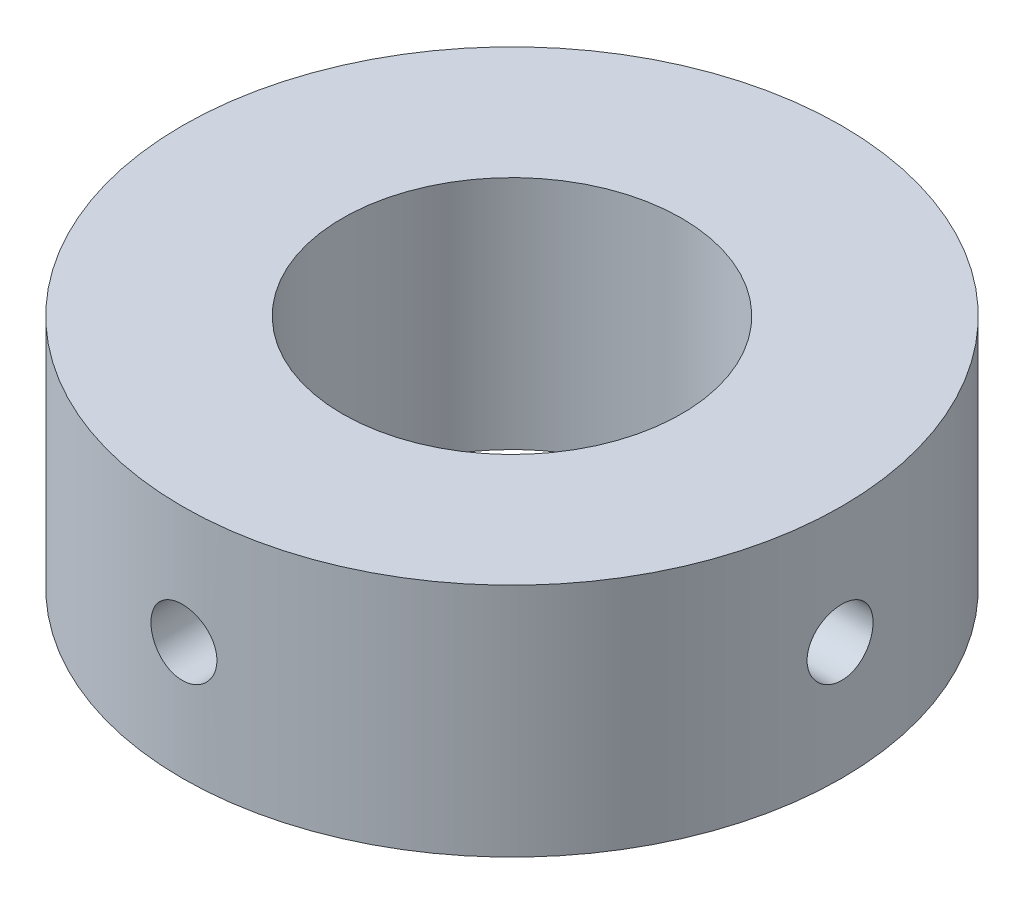
ISO-10303-21;
HEADER;
FILE_DESCRIPTION(('STEP AP214'),'2;1');
FILE_NAME('part.step','',(''),(''),'','','');
FILE_SCHEMA(('AUTOMOTIVE_DESIGN { 1 0 10303 214 1 1 1 1 }'));
ENDSEC;
DATA;
#1=APPLICATION_CONTEXT('core data for automotive mechanical design processes');
#2=APPLICATION_PROTOCOL_DEFINITION('international standard','automotive_design',2000,#1);
#3=PRODUCT_CONTEXT('',#1,'mechanical');
#4=PRODUCT('Part','Part','',(#3));
#5=PRODUCT_RELATED_PRODUCT_CATEGORY('part','',(#4));
#6=PRODUCT_DEFINITION_FORMATION('','',#4);
#7=PRODUCT_DEFINITION_CONTEXT('part definition',#1,'design');
#8=PRODUCT_DEFINITION('design','',#6,#7);
#9=PRODUCT_DEFINITION_SHAPE('','',#8);
#10=(LENGTH_UNIT() NAMED_UNIT(*) SI_UNIT(.MILLI.,.METRE.));
#11=(NAMED_UNIT(*) PLANE_ANGLE_UNIT() SI_UNIT($,.RADIAN.));
#12=(NAMED_UNIT(*) SI_UNIT($,.STERADIAN.) SOLID_ANGLE_UNIT());
#13=UNCERTAINTY_MEASURE_WITH_UNIT(LENGTH_MEASURE(1.E-05),#10,'distance_accuracy_value','');
#14=(GEOMETRIC_REPRESENTATION_CONTEXT(3) GLOBAL_UNCERTAINTY_ASSIGNED_CONTEXT((#13)) GLOBAL_UNIT_ASSIGNED_CONTEXT((#10,
#11,#12)) REPRESENTATION_CONTEXT('',''));
#15=CARTESIAN_POINT('',(0.,0.,0.));
#16=DIRECTION('',(0.,0.,1.));
#17=DIRECTION('',(1.,0.,0.));
#18=AXIS2_PLACEMENT_3D('',#15,#16,#17);
#19=CARTESIAN_POINT('',(0.,6.35,0.));
#20=DIRECTION('',(0.,-1.,0.));
#21=DIRECTION('',(0.,0.,-1.));
#22=AXIS2_PLACEMENT_3D('',#19,#20,#21);
#23=CYLINDRICAL_SURFACE('',#22,8.89);
#24=CARTESIAN_POINT('',(0.,6.35,0.));
#25=DIRECTION('',(0.,1.,0.));
#26=DIRECTION('',(0.,0.,1.));
#27=AXIS2_PLACEMENT_3D('',#24,#25,#26);
#28=CIRCLE('',#27,8.89);
#29=CARTESIAN_POINT('',(0.,6.35,8.89));
#30=VERTEX_POINT('',#29);
#31=EDGE_CURVE('E10',#30,#30,#28,.T.);
#32=ORIENTED_EDGE('',*,*,#31,.F.);
#33=EDGE_LOOP('',(#32));
#34=FACE_BOUND('',#33,.T.);
#35=CARTESIAN_POINT('',(0.,0.,0.));
#36=DIRECTION('',(0.,1.,0.));
#37=DIRECTION('',(0.,0.,1.));
#38=AXIS2_PLACEMENT_3D('',#35,#36,#37);
#39=CIRCLE('',#38,8.89);
#40=CARTESIAN_POINT('',(0.,0.,8.89));
#41=VERTEX_POINT('',#40);
#42=EDGE_CURVE('E40',#41,#41,#39,.T.);
#43=ORIENTED_EDGE('',*,*,#42,.T.);
#44=EDGE_LOOP('',(#43));
#45=FACE_BOUND('',#44,.T.);
#46=CARTESIAN_POINT('',(8.84543831587785,3.175,0.889));
#47=CARTESIAN_POINT('',(8.84543889986447,3.22480139255033,0.888997842746832));
#48=CARTESIAN_POINT('',(8.8458634346786,3.27463571371813,0.884801127635421));
#49=CARTESIAN_POINT('',(8.84751546839168,3.37292268061495,0.868123003824806));
#50=CARTESIAN_POINT('',(8.84874385217024,3.42137374223533,0.855632465034041));
#51=CARTESIAN_POINT('',(8.85186308279127,3.51545661328472,0.822734043185276));
#52=CARTESIAN_POINT('',(8.85375352795096,3.56109011246899,0.802330959985276));
#53=CARTESIAN_POINT('',(8.85798338128348,3.64827496734736,0.754195833710689));
#54=CARTESIAN_POINT('',(8.86032270026188,3.68982713155602,0.726465246251448));
#55=CARTESIAN_POINT('',(8.865196248451,3.76783077339152,0.664353933416848));
#56=CARTESIAN_POINT('',(8.86773108344681,3.80426532344886,0.629951994698243));
#57=CARTESIAN_POINT('',(8.87270455154554,3.87085373440417,0.555519844919092));
#58=CARTESIAN_POINT('',(8.87514318024264,3.90100730793221,0.515489376479939));
#59=CARTESIAN_POINT('',(8.87965544625333,3.95423628747936,0.430832835507727));
#60=CARTESIAN_POINT('',(8.88172830745341,3.97729671792757,0.386197301988787));
#61=CARTESIAN_POINT('',(8.8852688920256,4.01558900106918,0.293663356031597));
#62=CARTESIAN_POINT('',(8.8867366301481,4.03082104458846,0.245765023160047));
#63=CARTESIAN_POINT('',(8.88889734281642,4.05297454141504,0.148236111858483));
#64=CARTESIAN_POINT('',(8.88959290772264,4.0599237863147,0.0986119045310767));
#65=CARTESIAN_POINT('',(8.89013971167237,4.06540041425987,-0.00110301847246971));
#66=CARTESIAN_POINT('',(8.88999097260747,4.06392801566644,-0.0511937220194155));
#67=CARTESIAN_POINT('',(8.88886804795644,4.05262571381401,-0.150231082373393));
#68=CARTESIAN_POINT('',(8.88789681403872,4.0428256952637,-0.199181187812196));
#69=CARTESIAN_POINT('',(8.88524144316523,4.01519289636645,-0.294738330579529));
#70=CARTESIAN_POINT('',(8.88355729694902,3.99736001167585,-0.34134533746342));
#71=CARTESIAN_POINT('',(8.87966037423201,3.9541349234668,-0.430987479750152));
#72=CARTESIAN_POINT('',(8.87744667428159,3.92872949549569,-0.474016196602686));
#73=CARTESIAN_POINT('',(8.87273903837753,3.87109009075397,-0.555210293211857));
#74=CARTESIAN_POINT('',(8.87024509420595,3.83885591371093,-0.593375530280575));
#75=CARTESIAN_POINT('',(8.8652439589292,3.76830594996237,-0.66393433415037));
#76=CARTESIAN_POINT('',(8.86273675761421,3.72996416652474,-0.696301912363215));
#77=CARTESIAN_POINT('',(8.8580025779619,3.64837750682762,-0.754145398933188));
#78=CARTESIAN_POINT('',(8.85577560003104,3.60513262345605,-0.779621297293558));
#79=CARTESIAN_POINT('',(8.85185380578078,3.51494735459739,-0.822958132085601));
#80=CARTESIAN_POINT('',(8.85015910168841,3.46800619237605,-0.840817462889361));
#81=CARTESIAN_POINT('',(8.84749603763263,3.37177072249754,-0.868393633981816));
#82=CARTESIAN_POINT('',(8.84652765554072,3.32247648657906,-0.878110722337556));
#83=CARTESIAN_POINT('',(8.84543070088873,3.22316230439827,-0.889093145323452));
#84=CARTESIAN_POINT('',(8.84529851565819,3.17314641698456,-0.890394838019371));
#85=CARTESIAN_POINT('',(8.84587938654392,3.07360842468348,-0.884605003468641));
#86=CARTESIAN_POINT('',(8.84659243123927,3.02408631313321,-0.877513589631271));
#87=CARTESIAN_POINT('',(8.84878013191515,2.92704760335455,-0.855169260137185));
#88=CARTESIAN_POINT('',(8.85025318339196,2.87952700729685,-0.839933536070939));
#89=CARTESIAN_POINT('',(8.85379361733488,2.78771599401176,-0.80175062379191));
#90=CARTESIAN_POINT('',(8.85586101341487,2.7434256508047,-0.77880325893661));
#91=CARTESIAN_POINT('',(8.86036593492229,2.65916666308842,-0.725757376265241));
#92=CARTESIAN_POINT('',(8.86280469714243,2.619213253592,-0.695634765558375));
#93=CARTESIAN_POINT('',(8.8677735120379,2.54491675763936,-0.629127994238094));
#94=CARTESIAN_POINT('',(8.8703035669724,2.51057381013767,-0.592743678586592));
#95=CARTESIAN_POINT('',(8.87518079538029,2.4483477279091,-0.514588585957336));
#96=CARTESIAN_POINT('',(8.87752727715317,2.42048831152785,-0.472798875556844));
#97=CARTESIAN_POINT('',(8.88176290032794,2.3721833328978,-0.38511277078383));
#98=CARTESIAN_POINT('',(8.88365204799621,2.35173766906418,-0.339216432691938));
#99=CARTESIAN_POINT('',(8.88675702058051,2.31888076055441,-0.244702696398774));
#100=CARTESIAN_POINT('',(8.88797404550421,2.30645519006788,-0.196090319470815));
#101=CARTESIAN_POINT('',(8.88960256911534,2.28994443114352,-0.0974564596314919));
#102=CARTESIAN_POINT('',(8.89001409044164,2.28585900830354,-0.0474350163623827));
#103=CARTESIAN_POINT('',(8.88998522760497,2.28614781086511,0.0523640772033374));
#104=CARTESIAN_POINT('',(8.88954855136859,2.29048521554779,0.102141839222604));
#105=CARTESIAN_POINT('',(8.88787967790478,2.30741933988905,0.200257818748805));
#106=CARTESIAN_POINT('',(8.88664748005292,2.32001606603057,0.248596035125776));
#107=CARTESIAN_POINT('',(8.88352562470611,2.35310105982232,0.342460498894523));
#108=CARTESIAN_POINT('',(8.88163605688888,2.37358825110447,0.387987128842922));
#109=CARTESIAN_POINT('',(8.87741009238087,2.42186868716719,0.474961229537612));
#110=CARTESIAN_POINT('',(8.87507369830463,2.44966188919802,0.516408724150248));
#111=CARTESIAN_POINT('',(8.8702036117079,2.51190345131211,0.594236692015547));
#112=CARTESIAN_POINT('',(8.86766913308561,2.54637922444163,0.630595193408993));
#113=CARTESIAN_POINT('',(8.86269517194226,2.6209532875239,0.697027348100503));
#114=CARTESIAN_POINT('',(8.86025571236453,2.66105292479531,0.727099491052736));
#115=CARTESIAN_POINT('',(8.85574134852024,2.7458479999668,0.780165633336982));
#116=CARTESIAN_POINT('',(8.85366738721597,2.79055486709708,0.803141436127408));
#117=CARTESIAN_POINT('',(8.85013008143828,2.8831842309179,0.841229325499805));
#118=CARTESIAN_POINT('',(8.84866604859836,2.93110303128996,0.856350281864083));
#119=CARTESIAN_POINT('',(8.84688356701411,3.01191094165931,0.874528580928507));
#120=CARTESIAN_POINT('',(8.84634416090832,3.04428344141141,0.879947946322022));
#121=CARTESIAN_POINT('',(8.84562134382943,3.10943253668483,0.887184358499946));
#122=CARTESIAN_POINT('',(8.84543793136192,3.14220913050925,0.889001420406207));
#123=CARTESIAN_POINT('',(8.84543831587785,3.175,0.889));
#124=B_SPLINE_CURVE_WITH_KNOTS('',3,(#46,#47,#48,#49,#50,#51,#52,#53,#54,#55,#56,#57,#58,#59,
#60,#61,#62,#63,#64,#65,#66,#67,#68,#69,#70,#71,#72,#73,#74,#75,#76,#77,#78,#79,#80,#81,#82,#83,
#84,#85,#86,#87,#88,#89,#90,#91,#92,#93,#94,#95,#96,#97,#98,#99,#100,#101,#102,#103,#104,#105,
#106,#107,#108,#109,#110,#111,#112,#113,#114,#115,#116,#117,#118,#119,#120,#121,#122,#123),
.UNSPECIFIED.,.T.,.F.,(4,2,2,2,2,2,2,2,2,2,2,2,2,2,2,2,2,2,2,2,2,2,2,2,2,2,2,2,2,2,2,2,2,2,2,2,
2,2,4),(0.,0.149284431054015,0.298733471969553,0.448091996496754,0.597420873094548,
0.747232606001034,0.897051191653198,1.04718394804478,1.19731304460529,1.34693697628722,
1.49655702845428,1.6456424068679,1.79472972189586,1.94407893919641,2.09343253719272,
2.24343972900566,2.39344713841103,2.54348615485843,2.69352059994984,2.84290639717603,
2.99229017589548,3.14135986272324,3.29043296436771,3.44001385742617,3.58959845459927,
3.73972195631307,3.88984340092506,4.03969594505287,4.1895442774759,4.33873901653481,
4.48793387270029,4.63710838383774,4.786282022128,4.93608106668771,5.08591606035693,
5.23613213311653,5.38617820940767,5.48447238541775,5.58276614880492),.UNSPECIFIED.);
#125=CARTESIAN_POINT('',(8.84543831587785,3.175,0.889));
#126=VERTEX_POINT('',#125);
#127=EDGE_CURVE('E59',#126,#126,#124,.T.);
#128=ORIENTED_EDGE('',*,*,#127,.T.);
#129=EDGE_LOOP('',(#128));
#130=FACE_BOUND('',#129,.T.);
#131=CARTESIAN_POINT('',(-0.889,3.175,8.84543831587785));
#132=CARTESIAN_POINT('',(-0.888997842746832,3.22480139255033,8.84543889986447));
#133=CARTESIAN_POINT('',(-0.884801127635421,3.27463571371813,8.8458634346786));
#134=CARTESIAN_POINT('',(-0.868123003824806,3.37292268061495,8.84751546839168));
#135=CARTESIAN_POINT('',(-0.855632465034041,3.42137374223533,8.84874385217024));
#136=CARTESIAN_POINT('',(-0.822734043185276,3.51545661328472,8.85186308279127));
#137=CARTESIAN_POINT('',(-0.802330959985276,3.56109011246899,8.85375352795096));
#138=CARTESIAN_POINT('',(-0.754195833710689,3.64827496734736,8.85798338128348));
#139=CARTESIAN_POINT('',(-0.726465246251448,3.68982713155602,8.86032270026188));
#140=CARTESIAN_POINT('',(-0.664353933416848,3.76783077339152,8.865196248451));
#141=CARTESIAN_POINT('',(-0.629951994698243,3.80426532344886,8.86773108344681));
#142=CARTESIAN_POINT('',(-0.555519844919092,3.87085373440417,8.87270455154554));
#143=CARTESIAN_POINT('',(-0.515489376479939,3.90100730793221,8.87514318024264));
#144=CARTESIAN_POINT('',(-0.430832835507727,3.95423628747936,8.87965544625333));
#145=CARTESIAN_POINT('',(-0.386197301988787,3.97729671792757,8.88172830745341));
#146=CARTESIAN_POINT('',(-0.293663356031597,4.01558900106918,8.8852688920256));
#147=CARTESIAN_POINT('',(-0.245765023160047,4.03082104458846,8.8867366301481));
#148=CARTESIAN_POINT('',(-0.148236111858483,4.05297454141504,8.88889734281642));
#149=CARTESIAN_POINT('',(-0.0986119045310767,4.0599237863147,8.88959290772264));
#150=CARTESIAN_POINT('',(0.00110301847246974,4.06540041425987,8.89013971167237));
#151=CARTESIAN_POINT('',(0.0511937220194155,4.06392801566644,8.88999097260747));
#152=CARTESIAN_POINT('',(0.150231082373393,4.05262571381401,8.88886804795644));
#153=CARTESIAN_POINT('',(0.199181187812196,4.0428256952637,8.88789681403872));
#154=CARTESIAN_POINT('',(0.294738330579529,4.01519289636645,8.88524144316523));
#155=CARTESIAN_POINT('',(0.34134533746342,3.99736001167585,8.88355729694902));
#156=CARTESIAN_POINT('',(0.430987479750152,3.9541349234668,8.87966037423201));
#157=CARTESIAN_POINT('',(0.474016196602686,3.92872949549569,8.87744667428159));
#158=CARTESIAN_POINT('',(0.555210293211857,3.87109009075397,8.87273903837753));
#159=CARTESIAN_POINT('',(0.593375530280575,3.83885591371093,8.87024509420595));
#160=CARTESIAN_POINT('',(0.66393433415037,3.76830594996237,8.8652439589292));
#161=CARTESIAN_POINT('',(0.696301912363215,3.72996416652474,8.86273675761421));
#162=CARTESIAN_POINT('',(0.754145398933188,3.64837750682762,8.8580025779619));
#163=CARTESIAN_POINT('',(0.779621297293558,3.60513262345605,8.85577560003104));
#164=CARTESIAN_POINT('',(0.822958132085601,3.51494735459739,8.85185380578078));
#165=CARTESIAN_POINT('',(0.840817462889361,3.46800619237605,8.85015910168841));
#166=CARTESIAN_POINT('',(0.868393633981816,3.37177072249754,8.84749603763263));
#167=CARTESIAN_POINT('',(0.878110722337556,3.32247648657906,8.84652765554072));
#168=CARTESIAN_POINT('',(0.889093145323452,3.22316230439827,8.84543070088873));
#169=CARTESIAN_POINT('',(0.890394838019371,3.17314641698456,8.84529851565819));
#170=CARTESIAN_POINT('',(0.884605003468641,3.07360842468348,8.84587938654392));
#171=CARTESIAN_POINT('',(0.877513589631271,3.02408631313321,8.84659243123927));
#172=CARTESIAN_POINT('',(0.855169260137185,2.92704760335455,8.84878013191515));
#173=CARTESIAN_POINT('',(0.839933536070939,2.87952700729685,8.85025318339196));
#174=CARTESIAN_POINT('',(0.80175062379191,2.78771599401176,8.85379361733488));
#175=CARTESIAN_POINT('',(0.77880325893661,2.7434256508047,8.85586101341487));
#176=CARTESIAN_POINT('',(0.725757376265241,2.65916666308842,8.86036593492229));
#177=CARTESIAN_POINT('',(0.695634765558375,2.619213253592,8.86280469714243));
#178=CARTESIAN_POINT('',(0.629127994238094,2.54491675763936,8.8677735120379));
#179=CARTESIAN_POINT('',(0.592743678586592,2.51057381013767,8.8703035669724));
#180=CARTESIAN_POINT('',(0.514588585957336,2.4483477279091,8.87518079538029));
#181=CARTESIAN_POINT('',(0.472798875556844,2.42048831152785,8.87752727715317));
#182=CARTESIAN_POINT('',(0.38511277078383,2.3721833328978,8.88176290032794));
#183=CARTESIAN_POINT('',(0.339216432691938,2.35173766906418,8.88365204799621));
#184=CARTESIAN_POINT('',(0.244702696398774,2.31888076055441,8.88675702058051));
#185=CARTESIAN_POINT('',(0.196090319470815,2.30645519006788,8.88797404550421));
#186=CARTESIAN_POINT('',(0.0974564596314918,2.28994443114352,8.88960256911534));
#187=CARTESIAN_POINT('',(0.0474350163623826,2.28585900830354,8.89001409044164));
#188=CARTESIAN_POINT('',(-0.0523640772033375,2.28614781086511,8.88998522760497));
#189=CARTESIAN_POINT('',(-0.102141839222604,2.29048521554779,8.88954855136859));
#190=CARTESIAN_POINT('',(-0.200257818748805,2.30741933988905,8.88787967790478));
#191=CARTESIAN_POINT('',(-0.248596035125776,2.32001606603057,8.88664748005292));
#192=CARTESIAN_POINT('',(-0.342460498894523,2.35310105982232,8.88352562470611));
#193=CARTESIAN_POINT('',(-0.387987128842922,2.37358825110447,8.88163605688888));
#194=CARTESIAN_POINT('',(-0.474961229537612,2.42186868716719,8.87741009238087));
#195=CARTESIAN_POINT('',(-0.516408724150248,2.44966188919802,8.87507369830463));
#196=CARTESIAN_POINT('',(-0.594236692015547,2.51190345131211,8.8702036117079));
#197=CARTESIAN_POINT('',(-0.630595193408993,2.54637922444163,8.86766913308561));
#198=CARTESIAN_POINT('',(-0.697027348100503,2.6209532875239,8.86269517194226));
#199=CARTESIAN_POINT('',(-0.727099491052736,2.66105292479531,8.86025571236453));
#200=CARTESIAN_POINT('',(-0.780165633336982,2.7458479999668,8.85574134852024));
#201=CARTESIAN_POINT('',(-0.803141436127408,2.79055486709708,8.85366738721597));
#202=CARTESIAN_POINT('',(-0.841229325499805,2.8831842309179,8.85013008143828));
#203=CARTESIAN_POINT('',(-0.856350281864083,2.93110303128996,8.84866604859836));
#204=CARTESIAN_POINT('',(-0.874528580928507,3.01191094165931,8.84688356701411));
#205=CARTESIAN_POINT('',(-0.879947946322022,3.04428344141141,8.84634416090832));
#206=CARTESIAN_POINT('',(-0.887184358499946,3.10943253668483,8.84562134382943));
#207=CARTESIAN_POINT('',(-0.889001420406207,3.14220913050925,8.84543793136192));
#208=CARTESIAN_POINT('',(-0.889,3.175,8.84543831587785));
#209=B_SPLINE_CURVE_WITH_KNOTS('',3,(#131,#132,#133,#134,#135,#136,#137,#138,#139,#140,#141,
#142,#143,#144,#145,#146,#147,#148,#149,#150,#151,#152,#153,#154,#155,#156,#157,#158,#159,#160,
#161,#162,#163,#164,#165,#166,#167,#168,#169,#170,#171,#172,#173,#174,#175,#176,#177,#178,#179,
#180,#181,#182,#183,#184,#185,#186,#187,#188,#189,#190,#191,#192,#193,#194,#195,#196,#197,#198,
#199,#200,#201,#202,#203,#204,#205,#206,#207,#208),.UNSPECIFIED.,.T.,.F.,(4,2,2,2,2,2,2,2,2,2,2,
2,2,2,2,2,2,2,2,2,2,2,2,2,2,2,2,2,2,2,2,2,2,2,2,2,2,2,4),(0.,0.149284431054015,
0.298733471969553,0.448091996496754,0.597420873094548,0.747232606001034,0.897051191653198,
1.04718394804478,1.19731304460529,1.34693697628722,1.49655702845428,1.6456424068679,
1.79472972189586,1.94407893919641,2.09343253719272,2.24343972900566,2.39344713841103,
2.54348615485843,2.69352059994984,2.84290639717603,2.99229017589548,3.14135986272324,
3.29043296436771,3.44001385742617,3.58959845459927,3.73972195631307,3.88984340092506,
4.03969594505287,4.1895442774759,4.33873901653481,4.48793387270029,4.63710838383774,
4.786282022128,4.93608106668771,5.08591606035693,5.23613213311653,5.38617820940767,
5.48447238541775,5.58276614880492),.UNSPECIFIED.);
#210=CARTESIAN_POINT('',(-0.889,3.175,8.84543831587785));
#211=VERTEX_POINT('',#210);
#212=EDGE_CURVE('E92',#211,#211,#209,.T.);
#213=ORIENTED_EDGE('',*,*,#212,.T.);
#214=EDGE_LOOP('',(#213));
#215=FACE_BOUND('',#214,.T.);
#216=ADVANCED_FACE('F37',(#34,#45,#130,#215),#23,.T.);
#217=CARTESIAN_POINT('',(0.,6.35,0.));
#218=DIRECTION('',(0.,-1.,0.));
#219=DIRECTION('',(0.,0.,-1.));
#220=AXIS2_PLACEMENT_3D('',#217,#218,#219);
#221=CYLINDRICAL_SURFACE('',#220,4.572);
#222=CARTESIAN_POINT('',(4.48473667008443,3.175,0.889));
#223=CARTESIAN_POINT('',(4.484737642636,3.22442640849399,0.888998140814005));
#224=CARTESIAN_POINT('',(4.48556264448461,3.27387654840154,0.884864010478837));
#225=CARTESIAN_POINT('',(4.48876899778666,3.37137996789012,0.868449308597513));
#226=CARTESIAN_POINT('',(4.49115162838292,3.41943206547723,0.856162041476268));
#227=CARTESIAN_POINT('',(4.49719342142709,3.51271459471943,0.823834764819868));
#228=CARTESIAN_POINT('',(4.50085135033537,3.55794770340082,0.803802244891879));
#229=CARTESIAN_POINT('',(4.50903011912911,3.64440908400854,0.756573321078222));
#230=CARTESIAN_POINT('',(4.51355090221067,3.68563761929672,0.729377388733529));
#231=CARTESIAN_POINT('',(4.52301354107814,3.76347347999998,0.668205930866873));
#232=CARTESIAN_POINT('',(4.52795979613049,3.80001946088659,0.63415301765999));
#233=CARTESIAN_POINT('',(4.53767728003765,3.86691774187138,0.560401461641954));
#234=CARTESIAN_POINT('',(4.54244849696182,3.89726962041885,0.520702434886228));
#235=CARTESIAN_POINT('',(4.55132562195848,3.95115482290001,0.436380815476986));
#236=CARTESIAN_POINT('',(4.55542573977348,3.97463005697895,0.391720439051688));
#237=CARTESIAN_POINT('',(4.5624493549543,4.01372101715307,0.29899640452131));
#238=CARTESIAN_POINT('',(4.56537295637947,4.02933743836735,0.250933047842027));
#239=CARTESIAN_POINT('',(4.56968305148856,4.05207708805841,0.153403610176241));
#240=CARTESIAN_POINT('',(4.57108826352083,4.0593038272684,0.103962504363145));
#241=CARTESIAN_POINT('',(4.57226783937727,4.0653817291842,0.00455097775357853));
#242=CARTESIAN_POINT('',(4.57204235209319,4.06423365655599,-0.0454193943019877));
#243=CARTESIAN_POINT('',(4.57000049582018,4.05367342968983,-0.143760338651606));
#244=CARTESIAN_POINT('',(4.56820558784158,4.04437275378063,-0.192143392135823));
#245=CARTESIAN_POINT('',(4.56325070896854,4.01794792301431,-0.286648733786454));
#246=CARTESIAN_POINT('',(4.56009068561256,4.00082346748707,-0.332770934992221));
#247=CARTESIAN_POINT('',(4.55272504103654,3.9591325754857,-0.421765763206312));
#248=CARTESIAN_POINT('',(4.54851325438613,3.93452206336174,-0.46461721121851));
#249=CARTESIAN_POINT('',(4.53950905688584,3.87859021158844,-0.545623587310608));
#250=CARTESIAN_POINT('',(4.53471658274704,3.84726814016248,-0.583778002547482));
#251=CARTESIAN_POINT('',(4.52498782298533,3.77818948073776,-0.654968341766947));
#252=CARTESIAN_POINT('',(4.52005046897733,3.74033534410813,-0.68790953344152));
#253=CARTESIAN_POINT('',(4.51066361045973,3.65959074044454,-0.746990887136831));
#254=CARTESIAN_POINT('',(4.50621411419761,3.61670018829283,-0.773130934191069));
#255=CARTESIAN_POINT('',(4.49830490051665,3.52696893814606,-0.81789808049099));
#256=CARTESIAN_POINT('',(4.49484711364946,3.48012076220994,-0.83651055436729));
#257=CARTESIAN_POINT('',(4.48934168214752,3.38387954262038,-0.865572782843082));
#258=CARTESIAN_POINT('',(4.48729386465183,3.33448681172534,-0.876023538082765));
#259=CARTESIAN_POINT('',(4.48487467077598,3.23541519118913,-0.888325567668126));
#260=CARTESIAN_POINT('',(4.48447668988019,3.18575388073663,-0.890313326758572));
#261=CARTESIAN_POINT('',(4.4853309164198,3.08680913595383,-0.885999571815607));
#262=CARTESIAN_POINT('',(4.48658303571788,3.0375256815824,-0.879698500516071));
#263=CARTESIAN_POINT('',(4.49057152584208,2.94118983180742,-0.859103391229102));
#264=CARTESIAN_POINT('',(4.49329446371905,2.89412137269582,-0.844881656489838));
#265=CARTESIAN_POINT('',(4.49990609866369,2.80303534397561,-0.808925964574196));
#266=CARTESIAN_POINT('',(4.50379488723393,2.75901801417091,-0.787191417729216));
#267=CARTESIAN_POINT('',(4.51236019289327,2.67468467789989,-0.736515775284432));
#268=CARTESIAN_POINT('',(4.51704585416258,2.6344211577657,-0.707488908369604));
#269=CARTESIAN_POINT('',(4.52665157592584,2.55928683475211,-0.643167522229621));
#270=CARTESIAN_POINT('',(4.53157165912782,2.52441655570135,-0.607872394902274));
#271=CARTESIAN_POINT('',(4.54117781589627,2.46054450228583,-0.531405089042379));
#272=CARTESIAN_POINT('',(4.54585948175815,2.43163478943446,-0.490155370520767));
#273=CARTESIAN_POINT('',(4.55438579424391,2.38115602425116,-0.403305270772477));
#274=CARTESIAN_POINT('',(4.55823047473837,2.35958667485436,-0.357705065705855));
#275=CARTESIAN_POINT('',(4.56463074343345,2.32453674019479,-0.263695999789593));
#276=CARTESIAN_POINT('',(4.56719335690078,2.31101199450364,-0.215304102942086));
#277=CARTESIAN_POINT('',(4.57077081345575,2.29229479310389,-0.116880818338056));
#278=CARTESIAN_POINT('',(4.57178583227639,2.28710139134811,-0.0668496173875128));
#279=CARTESIAN_POINT('',(4.57214987781822,2.28522926839897,0.0325511473593587));
#280=CARTESIAN_POINT('',(4.57152604199332,2.28841185257974,0.0819180525683137));
#281=CARTESIAN_POINT('',(4.56873922886259,2.30289624105021,0.179399337726012));
#282=CARTESIAN_POINT('',(4.56657626877663,2.31419795450233,0.227513731681729));
#283=CARTESIAN_POINT('',(4.56095465402552,2.34453957198825,0.321043698461544));
#284=CARTESIAN_POINT('',(4.55749864749902,2.3635636674242,0.366464568821173));
#285=CARTESIAN_POINT('',(4.54966396021267,2.40879291206355,0.453489843197415));
#286=CARTESIAN_POINT('',(4.54528521148891,2.43499859026393,0.49509396577009));
#287=CARTESIAN_POINT('',(4.53600266776793,2.49431929334613,0.573992974912792));
#288=CARTESIAN_POINT('',(4.53109185867807,2.52753398899273,0.611212106731852));
#289=CARTESIAN_POINT('',(4.52134149617608,2.59972415653565,0.679596305625663));
#290=CARTESIAN_POINT('',(4.51650195985403,2.63870098614243,0.710759941850027));
#291=CARTESIAN_POINT('',(4.50738858157874,2.72177961774074,0.766445400699442));
#292=CARTESIAN_POINT('',(4.50312093083298,2.765929101365,0.790897137228967));
#293=CARTESIAN_POINT('',(4.49570961523559,2.8577795025618,0.831996825679656));
#294=CARTESIAN_POINT('',(4.49256491264708,2.90547709174388,0.848651987007618));
#295=CARTESIAN_POINT('',(4.48839597216564,2.99024812383173,0.870385702989093));
#296=CARTESIAN_POINT('',(4.48703207687263,3.02683213617368,0.877353814277507));
#297=CARTESIAN_POINT('',(4.48520207374987,3.10060629643909,0.886661590623503));
#298=CARTESIAN_POINT('',(4.48473593803863,3.13779642550237,0.889001399421216));
#299=CARTESIAN_POINT('',(4.48473667008443,3.175,0.889));
#300=B_SPLINE_CURVE_WITH_KNOTS('',3,(#222,#223,#224,#225,#226,#227,#228,#229,#230,#231,#232,
#233,#234,#235,#236,#237,#238,#239,#240,#241,#242,#243,#244,#245,#246,#247,#248,#249,#250,#251,
#252,#253,#254,#255,#256,#257,#258,#259,#260,#261,#262,#263,#264,#265,#266,#267,#268,#269,#270,
#271,#272,#273,#274,#275,#276,#277,#278,#279,#280,#281,#282,#283,#284,#285,#286,#287,#288,#289,
#290,#291,#292,#293,#294,#295,#296,#297,#298,#299),.UNSPECIFIED.,.T.,.F.,(4,2,2,2,2,2,2,2,2,2,2,
2,2,2,2,2,2,2,2,2,2,2,2,2,2,2,2,2,2,2,2,2,2,2,2,2,2,2,4),(0.,0.148143039013354,
0.296407887891953,0.444529722802273,0.592641809835037,0.74253000378601,0.892428395246964,
1.04355875704167,1.19467574886872,1.34390777125264,1.4931261681099,1.64033544148188,
1.78755037262498,1.93564941207765,2.08376460733058,2.23432114053152,2.38488021857372,
2.53573042953052,2.68656214309756,2.83495191933393,2.98333376990286,3.1303828167238,
3.27744340781087,3.42632208126376,3.57521520576778,3.72625941625855,3.87729751325542,
4.0274986538357,4.17768273745278,4.32539569030554,4.47310699055748,4.62051742170219,
4.76793871405207,4.91761777898949,5.06733216863368,5.21855506542092,5.36963785049518,
5.48114952880724,5.59265774387224),.UNSPECIFIED.);
#301=CARTESIAN_POINT('',(4.48473667008443,3.175,0.889));
#302=VERTEX_POINT('',#301);
#303=EDGE_CURVE('E55',#302,#302,#300,.T.);
#304=ORIENTED_EDGE('',*,*,#303,.F.);
#305=EDGE_LOOP('',(#304));
#306=FACE_BOUND('',#305,.T.);
#307=CARTESIAN_POINT('',(0.,6.35,0.));
#308=DIRECTION('',(0.,1.,0.));
#309=DIRECTION('',(0.,0.,1.));
#310=AXIS2_PLACEMENT_3D('',#307,#308,#309);
#311=CIRCLE('',#310,4.572);
#312=CARTESIAN_POINT('',(0.,6.35,4.572));
#313=VERTEX_POINT('',#312);
#314=EDGE_CURVE('E49',#313,#313,#311,.T.);
#315=ORIENTED_EDGE('',*,*,#314,.T.);
#316=EDGE_LOOP('',(#315));
#317=FACE_BOUND('',#316,.T.);
#318=CARTESIAN_POINT('',(0.,0.,0.));
#319=DIRECTION('',(0.,1.,0.));
#320=DIRECTION('',(0.,0.,1.));
#321=AXIS2_PLACEMENT_3D('',#318,#319,#320);
#322=CIRCLE('',#321,4.572);
#323=CARTESIAN_POINT('',(0.,0.,4.572));
#324=VERTEX_POINT('',#323);
#325=EDGE_CURVE('E51',#324,#324,#322,.T.);
#326=ORIENTED_EDGE('',*,*,#325,.F.);
#327=EDGE_LOOP('',(#326));
#328=FACE_BOUND('',#327,.T.);
#329=CARTESIAN_POINT('',(-0.889,3.175,4.48473667008443));
#330=CARTESIAN_POINT('',(-0.888998140814005,3.22442640849399,4.484737642636));
#331=CARTESIAN_POINT('',(-0.884864010478837,3.27387654840154,4.48556264448461));
#332=CARTESIAN_POINT('',(-0.868449308597513,3.37137996789012,4.48876899778666));
#333=CARTESIAN_POINT('',(-0.856162041476268,3.41943206547723,4.49115162838292));
#334=CARTESIAN_POINT('',(-0.823834764819868,3.51271459471943,4.49719342142709));
#335=CARTESIAN_POINT('',(-0.803802244891879,3.55794770340082,4.50085135033537));
#336=CARTESIAN_POINT('',(-0.756573321078222,3.64440908400854,4.50903011912911));
#337=CARTESIAN_POINT('',(-0.729377388733529,3.68563761929672,4.51355090221067));
#338=CARTESIAN_POINT('',(-0.668205930866873,3.76347347999998,4.52301354107814));
#339=CARTESIAN_POINT('',(-0.63415301765999,3.80001946088659,4.52795979613049));
#340=CARTESIAN_POINT('',(-0.560401461641954,3.86691774187138,4.53767728003765));
#341=CARTESIAN_POINT('',(-0.520702434886228,3.89726962041885,4.54244849696182));
#342=CARTESIAN_POINT('',(-0.436380815476986,3.95115482290001,4.55132562195848));
#343=CARTESIAN_POINT('',(-0.391720439051688,3.97463005697895,4.55542573977348));
#344=CARTESIAN_POINT('',(-0.298996404521309,4.01372101715307,4.5624493549543));
#345=CARTESIAN_POINT('',(-0.250933047842027,4.02933743836735,4.56537295637947));
#346=CARTESIAN_POINT('',(-0.153403610176241,4.05207708805842,4.56968305148856));
#347=CARTESIAN_POINT('',(-0.103962504363145,4.0593038272684,4.57108826352083));
#348=CARTESIAN_POINT('',(-0.00455097775357828,4.0653817291842,4.57226783937727));
#349=CARTESIAN_POINT('',(0.0454193943019879,4.06423365655599,4.57204235209319));
#350=CARTESIAN_POINT('',(0.143760338651606,4.05367342968983,4.57000049582018));
#351=CARTESIAN_POINT('',(0.192143392135824,4.04437275378063,4.56820558784158));
#352=CARTESIAN_POINT('',(0.286648733786454,4.01794792301431,4.56325070896854));
#353=CARTESIAN_POINT('',(0.332770934992221,4.00082346748707,4.56009068561256));
#354=CARTESIAN_POINT('',(0.421765763206312,3.9591325754857,4.55272504103654));
#355=CARTESIAN_POINT('',(0.46461721121851,3.93452206336174,4.54851325438613));
#356=CARTESIAN_POINT('',(0.545623587310608,3.87859021158844,4.53950905688584));
#357=CARTESIAN_POINT('',(0.583778002547483,3.84726814016248,4.53471658274704));
#358=CARTESIAN_POINT('',(0.654968341766947,3.77818948073776,4.52498782298533));
#359=CARTESIAN_POINT('',(0.68790953344152,3.74033534410813,4.52005046897733));
#360=CARTESIAN_POINT('',(0.746990887136831,3.65959074044454,4.51066361045973));
#361=CARTESIAN_POINT('',(0.773130934191069,3.61670018829283,4.50621411419761));
#362=CARTESIAN_POINT('',(0.81789808049099,3.52696893814606,4.49830490051665));
#363=CARTESIAN_POINT('',(0.836510554367289,3.48012076220994,4.49484711364946));
#364=CARTESIAN_POINT('',(0.865572782843082,3.38387954262038,4.48934168214752));
#365=CARTESIAN_POINT('',(0.876023538082765,3.33448681172534,4.48729386465183));
#366=CARTESIAN_POINT('',(0.888325567668126,3.23541519118913,4.48487467077598));
#367=CARTESIAN_POINT('',(0.890313326758572,3.18575388073663,4.48447668988019));
#368=CARTESIAN_POINT('',(0.885999571815607,3.08680913595383,4.4853309164198));
#369=CARTESIAN_POINT('',(0.879698500516071,3.0375256815824,4.48658303571788));
#370=CARTESIAN_POINT('',(0.859103391229102,2.94118983180742,4.49057152584208));
#371=CARTESIAN_POINT('',(0.844881656489838,2.89412137269582,4.49329446371905));
#372=CARTESIAN_POINT('',(0.808925964574196,2.80303534397561,4.49990609866369));
#373=CARTESIAN_POINT('',(0.787191417729216,2.75901801417091,4.50379488723393));
#374=CARTESIAN_POINT('',(0.736515775284432,2.67468467789989,4.51236019289327));
#375=CARTESIAN_POINT('',(0.707488908369604,2.6344211577657,4.51704585416258));
#376=CARTESIAN_POINT('',(0.643167522229621,2.55928683475211,4.52665157592584));
#377=CARTESIAN_POINT('',(0.607872394902274,2.52441655570135,4.53157165912782));
#378=CARTESIAN_POINT('',(0.531405089042379,2.46054450228583,4.54117781589627));
#379=CARTESIAN_POINT('',(0.490155370520767,2.43163478943446,4.54585948175815));
#380=CARTESIAN_POINT('',(0.403305270772476,2.38115602425116,4.55438579424391));
#381=CARTESIAN_POINT('',(0.357705065705855,2.35958667485436,4.55823047473837));
#382=CARTESIAN_POINT('',(0.263695999789592,2.32453674019479,4.56463074343345));
#383=CARTESIAN_POINT('',(0.215304102942086,2.31101199450364,4.56719335690078));
#384=CARTESIAN_POINT('',(0.116880818338056,2.29229479310389,4.57077081345575));
#385=CARTESIAN_POINT('',(0.0668496173875126,2.28710139134811,4.57178583227639));
#386=CARTESIAN_POINT('',(-0.0325511473593588,2.28522926839897,4.57214987781822));
#387=CARTESIAN_POINT('',(-0.0819180525683137,2.28841185257974,4.57152604199332));
#388=CARTESIAN_POINT('',(-0.179399337726012,2.30289624105021,4.56873922886259));
#389=CARTESIAN_POINT('',(-0.227513731681729,2.31419795450233,4.56657626877663));
#390=CARTESIAN_POINT('',(-0.321043698461544,2.34453957198825,4.56095465402552));
#391=CARTESIAN_POINT('',(-0.366464568821173,2.3635636674242,4.55749864749902));
#392=CARTESIAN_POINT('',(-0.453489843197415,2.40879291206355,4.54966396021267));
#393=CARTESIAN_POINT('',(-0.49509396577009,2.43499859026393,4.54528521148891));
#394=CARTESIAN_POINT('',(-0.573992974912792,2.49431929334613,4.53600266776793));
#395=CARTESIAN_POINT('',(-0.611212106731852,2.52753398899273,4.53109185867807));
#396=CARTESIAN_POINT('',(-0.679596305625663,2.59972415653565,4.52134149617608));
#397=CARTESIAN_POINT('',(-0.710759941850027,2.63870098614243,4.51650195985403));
#398=CARTESIAN_POINT('',(-0.766445400699442,2.72177961774074,4.50738858157874));
#399=CARTESIAN_POINT('',(-0.790897137228967,2.765929101365,4.50312093083298));
#400=CARTESIAN_POINT('',(-0.831996825679656,2.8577795025618,4.49570961523559));
#401=CARTESIAN_POINT('',(-0.848651987007618,2.90547709174388,4.49256491264708));
#402=CARTESIAN_POINT('',(-0.870385702989093,2.99024812383173,4.48839597216564));
#403=CARTESIAN_POINT('',(-0.877353814277507,3.02683213617368,4.48703207687263));
#404=CARTESIAN_POINT('',(-0.886661590623503,3.10060629643909,4.48520207374987));
#405=CARTESIAN_POINT('',(-0.889001399421216,3.13779642550237,4.48473593803863));
#406=CARTESIAN_POINT('',(-0.889,3.175,4.48473667008443));
#407=B_SPLINE_CURVE_WITH_KNOTS('',3,(#329,#330,#331,#332,#333,#334,#335,#336,#337,#338,#339,
#340,#341,#342,#343,#344,#345,#346,#347,#348,#349,#350,#351,#352,#353,#354,#355,#356,#357,#358,
#359,#360,#361,#362,#363,#364,#365,#366,#367,#368,#369,#370,#371,#372,#373,#374,#375,#376,#377,
#378,#379,#380,#381,#382,#383,#384,#385,#386,#387,#388,#389,#390,#391,#392,#393,#394,#395,#396,
#397,#398,#399,#400,#401,#402,#403,#404,#405,#406),.UNSPECIFIED.,.T.,.F.,(4,2,2,2,2,2,2,2,2,2,2,
2,2,2,2,2,2,2,2,2,2,2,2,2,2,2,2,2,2,2,2,2,2,2,2,2,2,2,4),(0.,0.148143039013354,
0.296407887891953,0.444529722802273,0.592641809835037,0.74253000378601,0.892428395246964,
1.04355875704167,1.19467574886872,1.34390777125264,1.4931261681099,1.64033544148188,
1.78755037262498,1.93564941207765,2.08376460733058,2.23432114053152,2.38488021857372,
2.53573042953052,2.68656214309756,2.83495191933393,2.98333376990286,3.1303828167238,
3.27744340781087,3.42632208126376,3.57521520576778,3.72625941625855,3.87729751325542,
4.0274986538357,4.17768273745278,4.32539569030554,4.47310699055748,4.62051742170219,
4.76793871405207,4.91761777898949,5.06733216863368,5.21855506542092,5.36963785049518,
5.48114952880724,5.59265774387224),.UNSPECIFIED.);
#408=CARTESIAN_POINT('',(-0.889,3.175,4.48473667008443));
#409=VERTEX_POINT('',#408);
#410=EDGE_CURVE('E68',#409,#409,#407,.T.);
#411=ORIENTED_EDGE('',*,*,#410,.F.);
#412=EDGE_LOOP('',(#411));
#413=FACE_BOUND('',#412,.T.);
#414=ADVANCED_FACE('F105',(#306,#317,#328,#413),#221,.F.);
#415=CARTESIAN_POINT('',(0.,6.35,0.));
#416=DIRECTION('',(0.,1.,0.));
#417=DIRECTION('',(0.,0.,1.));
#418=AXIS2_PLACEMENT_3D('',#415,#416,#417);
#419=PLANE('',#418);
#420=ORIENTED_EDGE('',*,*,#31,.T.);
#421=EDGE_LOOP('',(#420));
#422=FACE_BOUND('',#421,.T.);
#423=ORIENTED_EDGE('',*,*,#314,.F.);
#424=EDGE_LOOP('',(#423));
#425=FACE_BOUND('',#424,.T.);
#426=ADVANCED_FACE('F107',(#422,#425),#419,.T.);
#427=CARTESIAN_POINT('',(0.,0.,0.));
#428=DIRECTION('',(0.,1.,0.));
#429=DIRECTION('',(0.,0.,1.));
#430=AXIS2_PLACEMENT_3D('',#427,#428,#429);
#431=PLANE('',#430);
#432=ORIENTED_EDGE('',*,*,#42,.F.);
#433=EDGE_LOOP('',(#432));
#434=FACE_BOUND('',#433,.T.);
#435=ORIENTED_EDGE('',*,*,#325,.T.);
#436=EDGE_LOOP('',(#435));
#437=FACE_BOUND('',#436,.T.);
#438=ADVANCED_FACE('F113',(#434,#437),#431,.F.);
#439=CARTESIAN_POINT('',(8.891,3.175,0.));
#440=DIRECTION('',(-1.,0.,0.));
#441=DIRECTION('',(0.,0.,1.));
#442=AXIS2_PLACEMENT_3D('',#439,#440,#441);
#443=CYLINDRICAL_SURFACE('',#442,0.889);
#444=ORIENTED_EDGE('',*,*,#303,.T.);
#445=EDGE_LOOP('',(#444));
#446=FACE_BOUND('',#445,.T.);
#447=ORIENTED_EDGE('',*,*,#127,.F.);
#448=EDGE_LOOP('',(#447));
#449=FACE_BOUND('',#448,.T.);
#450=ADVANCED_FACE('F74',(#446,#449),#443,.F.);
#451=CARTESIAN_POINT('',(0.,3.175,8.891));
#452=DIRECTION('',(0.,0.,-1.));
#453=DIRECTION('',(-1.,0.,0.));
#454=AXIS2_PLACEMENT_3D('',#451,#452,#453);
#455=CYLINDRICAL_SURFACE('',#454,0.889);
#456=ORIENTED_EDGE('',*,*,#410,.T.);
#457=EDGE_LOOP('',(#456));
#458=FACE_BOUND('',#457,.T.);
#459=ORIENTED_EDGE('',*,*,#212,.F.);
#460=EDGE_LOOP('',(#459));
#461=FACE_BOUND('',#460,.T.);
#462=ADVANCED_FACE('F80',(#458,#461),#455,.F.);
#463=CLOSED_SHELL('',(#216,#414,#426,#438,#450,#462));
#464=MANIFOLD_SOLID_BREP('B2',#463);
#465=ADVANCED_BREP_SHAPE_REPRESENTATION('',(#18,#464),#14);
#466=SHAPE_DEFINITION_REPRESENTATION(#9,#465);
ENDSEC;
END-ISO-10303-21;
